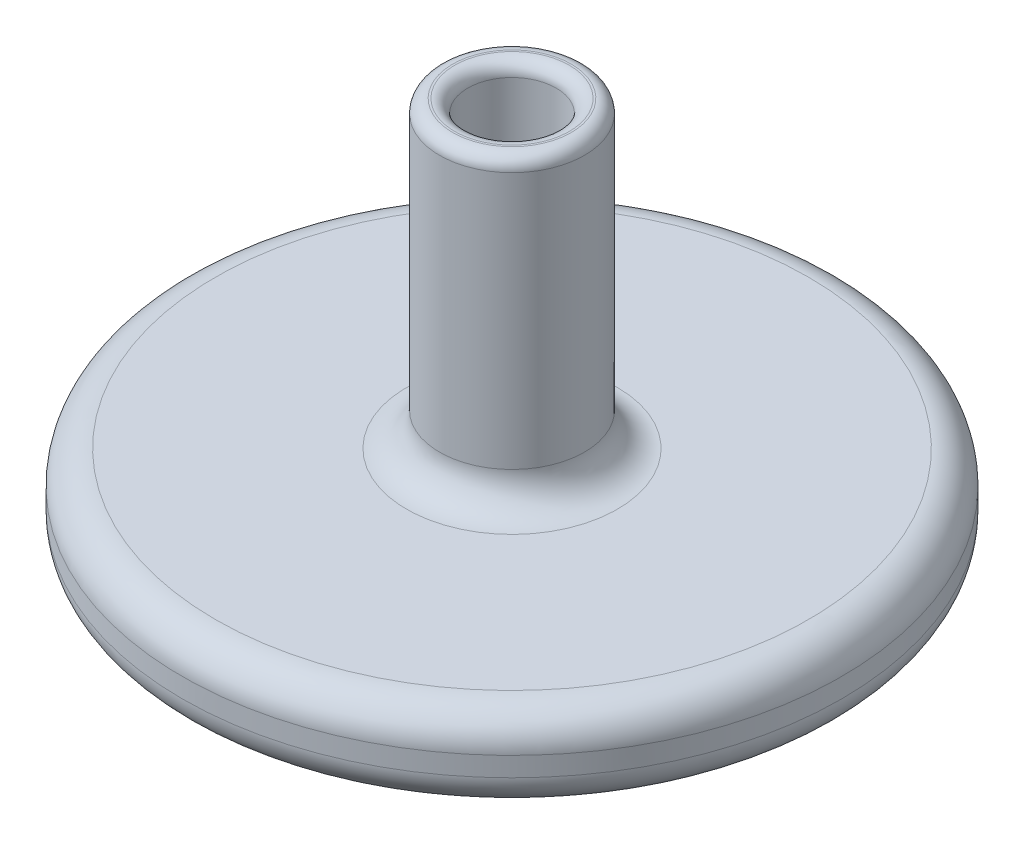
ISO-10303-21;
HEADER;
FILE_DESCRIPTION(('STEP AP214'),'2;1');
FILE_NAME('part.step','',(''),(''),'','','');
FILE_SCHEMA(('AUTOMOTIVE_DESIGN { 1 0 10303 214 1 1 1 1 }'));
ENDSEC;
DATA;
#1=APPLICATION_CONTEXT('core data for automotive mechanical design processes');
#2=APPLICATION_PROTOCOL_DEFINITION('international standard','automotive_design',2000,#1);
#3=PRODUCT_CONTEXT('',#1,'mechanical');
#4=PRODUCT('Part','Part','',(#3));
#5=PRODUCT_RELATED_PRODUCT_CATEGORY('part','',(#4));
#6=PRODUCT_DEFINITION_FORMATION('','',#4);
#7=PRODUCT_DEFINITION_CONTEXT('part definition',#1,'design');
#8=PRODUCT_DEFINITION('design','',#6,#7);
#9=PRODUCT_DEFINITION_SHAPE('','',#8);
#10=(LENGTH_UNIT() NAMED_UNIT(*) SI_UNIT(.MILLI.,.METRE.));
#11=(NAMED_UNIT(*) PLANE_ANGLE_UNIT() SI_UNIT($,.RADIAN.));
#12=(NAMED_UNIT(*) SI_UNIT($,.STERADIAN.) SOLID_ANGLE_UNIT());
#13=UNCERTAINTY_MEASURE_WITH_UNIT(LENGTH_MEASURE(1.E-05),#10,'distance_accuracy_value','');
#14=(GEOMETRIC_REPRESENTATION_CONTEXT(3) GLOBAL_UNCERTAINTY_ASSIGNED_CONTEXT((#13)) GLOBAL_UNIT_ASSIGNED_CONTEXT((#10,
#11,#12)) REPRESENTATION_CONTEXT('',''));
#15=CARTESIAN_POINT('',(0.,0.,0.));
#16=DIRECTION('',(0.,0.,1.));
#17=DIRECTION('',(1.,0.,0.));
#18=AXIS2_PLACEMENT_3D('',#15,#16,#17);
#19=CARTESIAN_POINT('',(-0.850899999999999,8.0518,0.));
#20=DIRECTION('',(0.,-1.,0.));
#21=DIRECTION('',(0.,0.,-1.));
#22=AXIS2_PLACEMENT_3D('',#19,#20,#21);
#23=PLANE('',#22);
#24=CARTESIAN_POINT('',(0.,8.0518,0.));
#25=DIRECTION('',(0.,-1.,0.));
#26=DIRECTION('',(0.,0.,-1.));
#27=AXIS2_PLACEMENT_3D('',#24,#25,#26);
#28=CIRCLE('',#27,1.1049);
#29=CARTESIAN_POINT('',(0.,8.0518,-1.1049));
#30=VERTEX_POINT('',#29);
#31=EDGE_CURVE('E41',#30,#30,#28,.T.);
#32=ORIENTED_EDGE('',*,*,#31,.T.);
#33=EDGE_LOOP('',(#32));
#34=FACE_BOUND('',#33,.T.);
#35=CARTESIAN_POINT('',(0.,8.0518,0.));
#36=DIRECTION('',(0.,-1.,0.));
#37=DIRECTION('',(0.,0.,-1.));
#38=AXIS2_PLACEMENT_3D('',#35,#36,#37);
#39=CIRCLE('',#38,1.143);
#40=CARTESIAN_POINT('',(0.,8.0518,-1.143));
#41=VERTEX_POINT('',#40);
#42=EDGE_CURVE('E45',#41,#41,#39,.F.);
#43=ORIENTED_EDGE('',*,*,#42,.T.);
#44=EDGE_LOOP('',(#43));
#45=FACE_BOUND('',#44,.T.);
#46=ADVANCED_FACE('F30',(#34,#45),#23,.F.);
#47=CARTESIAN_POINT('',(0.,-5.02375918642883E-12,0.));
#48=DIRECTION('',(0.,-1.,0.));
#49=DIRECTION('',(0.,0.,-1.));
#50=AXIS2_PLACEMENT_3D('',#47,#48,#49);
#51=CYLINDRICAL_SURFACE('',#50,0.850899999999999);
#52=CARTESIAN_POINT('',(0.,7.7978,0.));
#53=DIRECTION('',(0.,-1.,0.));
#54=DIRECTION('',(0.,0.,-1.));
#55=AXIS2_PLACEMENT_3D('',#52,#53,#54);
#56=CIRCLE('',#55,0.850899999999999);
#57=CARTESIAN_POINT('',(0.,7.7978,-0.850899999999999));
#58=VERTEX_POINT('',#57);
#59=EDGE_CURVE('E37',#58,#58,#56,.F.);
#60=ORIENTED_EDGE('',*,*,#59,.T.);
#61=EDGE_LOOP('',(#60));
#62=FACE_BOUND('',#61,.T.);
#63=CARTESIAN_POINT('',(0.,2.2098,0.));
#64=DIRECTION('',(0.,-1.,0.));
#65=DIRECTION('',(0.,0.,-1.));
#66=AXIS2_PLACEMENT_3D('',#63,#64,#65);
#67=CIRCLE('',#66,0.850899999999999);
#68=CARTESIAN_POINT('',(0.,2.2098,-0.850899999999999));
#69=VERTEX_POINT('',#68);
#70=EDGE_CURVE('E68',#69,#69,#67,.T.);
#71=ORIENTED_EDGE('',*,*,#70,.T.);
#72=EDGE_LOOP('',(#71));
#73=FACE_BOUND('',#72,.T.);
#74=ADVANCED_FACE('F72',(#62,#73),#51,.F.);
#75=CARTESIAN_POINT('',(-0.850899999999999,2.2098,0.));
#76=DIRECTION('',(0.,-1.,0.));
#77=DIRECTION('',(0.,0.,-1.));
#78=AXIS2_PLACEMENT_3D('',#75,#76,#77);
#79=PLANE('',#78);
#80=ORIENTED_EDGE('',*,*,#70,.F.);
#81=EDGE_LOOP('',(#80));
#82=FACE_BOUND('',#81,.T.);
#83=ADVANCED_FACE('F74',(#82),#79,.F.);
#84=CARTESIAN_POINT('',(0.,29.7410481481481,0.));
#85=DIRECTION('',(0.,-1.,0.));
#86=DIRECTION('',(-1.,0.,0.));
#87=AXIS2_PLACEMENT_3D('',#84,#85,#86);
#88=SPHERICAL_SURFACE('',#87,29.7410481481481);
#89=CARTESIAN_POINT('',(0.,0.578948615088695,0.));
#90=DIRECTION('',(0.,1.,0.));
#91=DIRECTION('',(0.,0.,1.));
#92=AXIS2_PLACEMENT_3D('',#89,#90,#91);
#93=CIRCLE('',#92,5.83968284878553);
#94=CARTESIAN_POINT('',(0.,0.578948615088695,5.83968284878553));
#95=VERTEX_POINT('',#94);
#96=EDGE_CURVE('E56',#95,#95,#93,.F.);
#97=ORIENTED_EDGE('',*,*,#96,.T.);
#98=EDGE_LOOP('',(#97));
#99=FACE_BOUND('',#98,.T.);
#100=ADVANCED_FACE('F76',(#99),#88,.T.);
#101=CARTESIAN_POINT('',(0.,-5.02375918642883E-12,0.));
#102=DIRECTION('',(0.,-1.,0.));
#103=DIRECTION('',(0.,0.,-1.));
#104=AXIS2_PLACEMENT_3D('',#101,#102,#103);
#105=CYLINDRICAL_SURFACE('',#104,6.35);
#106=CARTESIAN_POINT('',(0.,1.20158750499096,0.));
#107=DIRECTION('',(0.,1.,0.));
#108=DIRECTION('',(0.,0.,1.));
#109=AXIS2_PLACEMENT_3D('',#106,#107,#108);
#110=CIRCLE('',#109,6.35);
#111=CARTESIAN_POINT('',(0.,1.20158750499096,6.35));
#112=VERTEX_POINT('',#111);
#113=EDGE_CURVE('E50',#112,#112,#110,.T.);
#114=ORIENTED_EDGE('',*,*,#113,.T.);
#115=EDGE_LOOP('',(#114));
#116=FACE_BOUND('',#115,.T.);
#117=CARTESIAN_POINT('',(0.,1.5748,0.));
#118=DIRECTION('',(0.,-1.,0.));
#119=DIRECTION('',(0.,0.,-1.));
#120=AXIS2_PLACEMENT_3D('',#117,#118,#119);
#121=CIRCLE('',#120,6.35);
#122=CARTESIAN_POINT('',(0.,1.5748,-6.35));
#123=VERTEX_POINT('',#122);
#124=EDGE_CURVE('E53',#123,#123,#121,.T.);
#125=ORIENTED_EDGE('',*,*,#124,.T.);
#126=EDGE_LOOP('',(#125));
#127=FACE_BOUND('',#126,.T.);
#128=ADVANCED_FACE('F82',(#116,#127),#105,.T.);
#129=CARTESIAN_POINT('',(-1.397,2.2098,0.));
#130=DIRECTION('',(0.,-1.,0.));
#131=DIRECTION('',(0.,0.,-1.));
#132=AXIS2_PLACEMENT_3D('',#129,#130,#131);
#133=PLANE('',#132);
#134=CARTESIAN_POINT('',(0.,2.2098,0.));
#135=DIRECTION('',(0.,-1.,0.));
#136=DIRECTION('',(0.,0.,-1.));
#137=AXIS2_PLACEMENT_3D('',#134,#135,#136);
#138=CIRCLE('',#137,2.032);
#139=CARTESIAN_POINT('',(0.,2.2098,-2.032));
#140=VERTEX_POINT('',#139);
#141=EDGE_CURVE('E62',#140,#140,#138,.T.);
#142=ORIENTED_EDGE('',*,*,#141,.T.);
#143=EDGE_LOOP('',(#142));
#144=FACE_BOUND('',#143,.T.);
#145=CARTESIAN_POINT('',(0.,2.2098,0.));
#146=DIRECTION('',(0.,-1.,0.));
#147=DIRECTION('',(0.,0.,-1.));
#148=AXIS2_PLACEMENT_3D('',#145,#146,#147);
#149=CIRCLE('',#148,5.715);
#150=CARTESIAN_POINT('',(0.,2.2098,-5.715));
#151=VERTEX_POINT('',#150);
#152=EDGE_CURVE('E65',#151,#151,#149,.F.);
#153=ORIENTED_EDGE('',*,*,#152,.T.);
#154=EDGE_LOOP('',(#153));
#155=FACE_BOUND('',#154,.T.);
#156=ADVANCED_FACE('F132',(#144,#155),#133,.F.);
#157=CARTESIAN_POINT('',(0.,-5.02375918642883E-12,0.));
#158=DIRECTION('',(0.,-1.,0.));
#159=DIRECTION('',(0.,0.,-1.));
#160=AXIS2_PLACEMENT_3D('',#157,#158,#159);
#161=CYLINDRICAL_SURFACE('',#160,1.397);
#162=CARTESIAN_POINT('',(0.,7.7978,0.));
#163=DIRECTION('',(0.,-1.,0.));
#164=DIRECTION('',(0.,0.,-1.));
#165=AXIS2_PLACEMENT_3D('',#162,#163,#164);
#166=CIRCLE('',#165,1.397);
#167=CARTESIAN_POINT('',(0.,7.7978,-1.397));
#168=VERTEX_POINT('',#167);
#169=EDGE_CURVE('E10',#168,#168,#166,.T.);
#170=ORIENTED_EDGE('',*,*,#169,.T.);
#171=EDGE_LOOP('',(#170));
#172=FACE_BOUND('',#171,.T.);
#173=CARTESIAN_POINT('',(0.,2.8448,0.));
#174=DIRECTION('',(0.,-1.,0.));
#175=DIRECTION('',(0.,0.,-1.));
#176=AXIS2_PLACEMENT_3D('',#173,#174,#175);
#177=CIRCLE('',#176,1.397);
#178=CARTESIAN_POINT('',(0.,2.8448,-1.397));
#179=VERTEX_POINT('',#178);
#180=EDGE_CURVE('E59',#179,#179,#177,.F.);
#181=ORIENTED_EDGE('',*,*,#180,.T.);
#182=EDGE_LOOP('',(#181));
#183=FACE_BOUND('',#182,.T.);
#184=ADVANCED_FACE('F97',(#172,#183),#161,.T.);
#185=CARTESIAN_POINT('',(0.,2.8448,0.));
#186=DIRECTION('',(0.,-1.,0.));
#187=DIRECTION('',(0.,0.,-1.));
#188=AXIS2_PLACEMENT_3D('',#185,#186,#187);
#189=TOROIDAL_SURFACE('',#188,2.032,0.635);
#190=ORIENTED_EDGE('',*,*,#180,.F.);
#191=EDGE_LOOP('',(#190));
#192=FACE_BOUND('',#191,.T.);
#193=ORIENTED_EDGE('',*,*,#141,.F.);
#194=EDGE_LOOP('',(#193));
#195=FACE_BOUND('',#194,.T.);
#196=ADVANCED_FACE('F93',(#192,#195),#189,.F.);
#197=CARTESIAN_POINT('',(0.,1.20158750499096,0.));
#198=DIRECTION('',(0.,1.,0.));
#199=DIRECTION('',(0.,0.,1.));
#200=AXIS2_PLACEMENT_3D('',#197,#198,#199);
#201=TOROIDAL_SURFACE('',#200,5.715,0.635);
#202=ORIENTED_EDGE('',*,*,#113,.F.);
#203=EDGE_LOOP('',(#202));
#204=FACE_BOUND('',#203,.T.);
#205=ORIENTED_EDGE('',*,*,#96,.F.);
#206=EDGE_LOOP('',(#205));
#207=FACE_BOUND('',#206,.T.);
#208=ADVANCED_FACE('F96',(#204,#207),#201,.T.);
#209=CARTESIAN_POINT('',(0.,1.5748,0.));
#210=DIRECTION('',(0.,-1.,0.));
#211=DIRECTION('',(0.,0.,-1.));
#212=AXIS2_PLACEMENT_3D('',#209,#210,#211);
#213=TOROIDAL_SURFACE('',#212,5.715,0.635);
#214=ORIENTED_EDGE('',*,*,#152,.F.);
#215=EDGE_LOOP('',(#214));
#216=FACE_BOUND('',#215,.T.);
#217=ORIENTED_EDGE('',*,*,#124,.F.);
#218=EDGE_LOOP('',(#217));
#219=FACE_BOUND('',#218,.T.);
#220=ADVANCED_FACE('F101',(#216,#219),#213,.T.);
#221=CARTESIAN_POINT('',(0.,7.7978,0.));
#222=DIRECTION('',(0.,-1.,0.));
#223=DIRECTION('',(0.,0.,-1.));
#224=AXIS2_PLACEMENT_3D('',#221,#222,#223);
#225=TOROIDAL_SURFACE('',#224,1.1049,0.254);
#226=ORIENTED_EDGE('',*,*,#59,.F.);
#227=EDGE_LOOP('',(#226));
#228=FACE_BOUND('',#227,.T.);
#229=ORIENTED_EDGE('',*,*,#31,.F.);
#230=EDGE_LOOP('',(#229));
#231=FACE_BOUND('',#230,.T.);
#232=ADVANCED_FACE('F104',(#228,#231),#225,.T.);
#233=CARTESIAN_POINT('',(0.,7.7978,0.));
#234=DIRECTION('',(0.,-1.,0.));
#235=DIRECTION('',(0.,0.,-1.));
#236=AXIS2_PLACEMENT_3D('',#233,#234,#235);
#237=TOROIDAL_SURFACE('',#236,1.143,0.254);
#238=ORIENTED_EDGE('',*,*,#42,.F.);
#239=EDGE_LOOP('',(#238));
#240=FACE_BOUND('',#239,.T.);
#241=ORIENTED_EDGE('',*,*,#169,.F.);
#242=EDGE_LOOP('',(#241));
#243=FACE_BOUND('',#242,.T.);
#244=ADVANCED_FACE('F32',(#240,#243),#237,.T.);
#245=CLOSED_SHELL('',(#46,#74,#83,#100,#128,#156,#184,#196,#208,#220,#232,#244));
#246=MANIFOLD_SOLID_BREP('B2',#245);
#247=ADVANCED_BREP_SHAPE_REPRESENTATION('',(#18,#246),#14);
#248=SHAPE_DEFINITION_REPRESENTATION(#9,#247);
ENDSEC;
END-ISO-10303-21;
